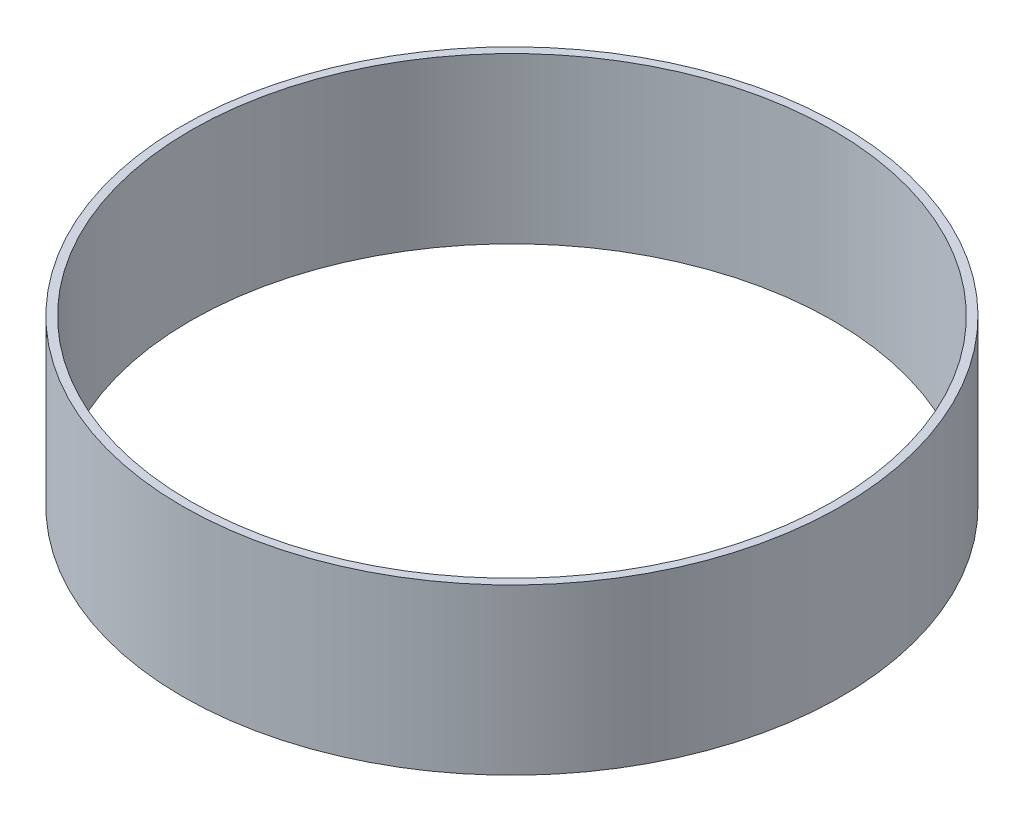
ISO-10303-21;
HEADER;
FILE_DESCRIPTION(('STEP AP214'),'2;1');
FILE_NAME('part.step','',(''),(''),'','','');
FILE_SCHEMA(('AUTOMOTIVE_DESIGN { 1 0 10303 214 1 1 1 1 }'));
ENDSEC;
DATA;
#1=APPLICATION_CONTEXT('core data for automotive mechanical design processes');
#2=APPLICATION_PROTOCOL_DEFINITION('international standard','automotive_design',2000,#1);
#3=PRODUCT_CONTEXT('',#1,'mechanical');
#4=PRODUCT('Part','Part','',(#3));
#5=PRODUCT_RELATED_PRODUCT_CATEGORY('part','',(#4));
#6=PRODUCT_DEFINITION_FORMATION('','',#4);
#7=PRODUCT_DEFINITION_CONTEXT('part definition',#1,'design');
#8=PRODUCT_DEFINITION('design','',#6,#7);
#9=PRODUCT_DEFINITION_SHAPE('','',#8);
#10=(LENGTH_UNIT() NAMED_UNIT(*) SI_UNIT(.MILLI.,.METRE.));
#11=(NAMED_UNIT(*) PLANE_ANGLE_UNIT() SI_UNIT($,.RADIAN.));
#12=(NAMED_UNIT(*) SI_UNIT($,.STERADIAN.) SOLID_ANGLE_UNIT());
#13=UNCERTAINTY_MEASURE_WITH_UNIT(LENGTH_MEASURE(1.E-05),#10,'distance_accuracy_value','');
#14=(GEOMETRIC_REPRESENTATION_CONTEXT(3) GLOBAL_UNCERTAINTY_ASSIGNED_CONTEXT((#13)) GLOBAL_UNIT_ASSIGNED_CONTEXT((#10,
#11,#12)) REPRESENTATION_CONTEXT('',''));
#15=CARTESIAN_POINT('',(0.,0.,0.));
#16=DIRECTION('',(0.,0.,1.));
#17=DIRECTION('',(1.,0.,0.));
#18=AXIS2_PLACEMENT_3D('',#15,#16,#17);
#19=CARTESIAN_POINT('',(0.,15.,0.));
#20=DIRECTION('',(0.,1.,0.));
#21=DIRECTION('',(0.,0.,1.));
#22=AXIS2_PLACEMENT_3D('',#19,#20,#21);
#23=PLANE('',#22);
#24=CARTESIAN_POINT('',(0.,15.,0.));
#25=DIRECTION('',(0.,1.,0.));
#26=DIRECTION('',(0.,0.,1.));
#27=AXIS2_PLACEMENT_3D('',#24,#25,#26);
#28=CIRCLE('',#27,60.);
#29=CARTESIAN_POINT('',(0.,15.,60.));
#30=VERTEX_POINT('',#29);
#31=EDGE_CURVE('E11',#30,#30,#28,.T.);
#32=ORIENTED_EDGE('',*,*,#31,.T.);
#33=EDGE_LOOP('',(#32));
#34=FACE_BOUND('',#33,.T.);
#35=CARTESIAN_POINT('',(0.,15.,0.));
#36=DIRECTION('',(0.,1.,0.));
#37=DIRECTION('',(1.,0.,0.));
#38=AXIS2_PLACEMENT_3D('',#35,#36,#37);
#39=CIRCLE('',#38,58.5);
#40=CARTESIAN_POINT('',(58.5,15.,0.));
#41=VERTEX_POINT('',#40);
#42=EDGE_CURVE('E48',#41,#41,#39,.T.);
#43=ORIENTED_EDGE('',*,*,#42,.F.);
#44=EDGE_LOOP('',(#43));
#45=FACE_BOUND('',#44,.T.);
#46=ADVANCED_FACE('F37',(#34,#45),#23,.T.);
#47=CARTESIAN_POINT('',(0.,-15.,0.));
#48=DIRECTION('',(0.,1.,0.));
#49=DIRECTION('',(0.,0.,1.));
#50=AXIS2_PLACEMENT_3D('',#47,#48,#49);
#51=PLANE('',#50);
#52=CARTESIAN_POINT('',(0.,-15.,0.));
#53=DIRECTION('',(0.,1.,0.));
#54=DIRECTION('',(0.,0.,1.));
#55=AXIS2_PLACEMENT_3D('',#52,#53,#54);
#56=CIRCLE('',#55,60.);
#57=CARTESIAN_POINT('',(0.,-15.,60.));
#58=VERTEX_POINT('',#57);
#59=EDGE_CURVE('E41',#58,#58,#56,.T.);
#60=ORIENTED_EDGE('',*,*,#59,.F.);
#61=EDGE_LOOP('',(#60));
#62=FACE_BOUND('',#61,.T.);
#63=CARTESIAN_POINT('',(0.,-15.,0.));
#64=DIRECTION('',(0.,1.,0.));
#65=DIRECTION('',(1.,0.,0.));
#66=AXIS2_PLACEMENT_3D('',#63,#64,#65);
#67=CIRCLE('',#66,58.5);
#68=CARTESIAN_POINT('',(58.5,-15.,0.));
#69=VERTEX_POINT('',#68);
#70=EDGE_CURVE('E50',#69,#69,#67,.T.);
#71=ORIENTED_EDGE('',*,*,#70,.T.);
#72=EDGE_LOOP('',(#71));
#73=FACE_BOUND('',#72,.T.);
#74=ADVANCED_FACE('F60',(#62,#73),#51,.F.);
#75=CARTESIAN_POINT('',(0.,15.,0.));
#76=DIRECTION('',(0.,-1.,0.));
#77=DIRECTION('',(0.,0.,-1.));
#78=AXIS2_PLACEMENT_3D('',#75,#76,#77);
#79=CYLINDRICAL_SURFACE('',#78,60.);
#80=ORIENTED_EDGE('',*,*,#31,.F.);
#81=EDGE_LOOP('',(#80));
#82=FACE_BOUND('',#81,.T.);
#83=ORIENTED_EDGE('',*,*,#59,.T.);
#84=EDGE_LOOP('',(#83));
#85=FACE_BOUND('',#84,.T.);
#86=ADVANCED_FACE('F39',(#82,#85),#79,.T.);
#87=CARTESIAN_POINT('',(0.,15.,0.));
#88=DIRECTION('',(0.,-1.,0.));
#89=DIRECTION('',(0.,0.,-1.));
#90=AXIS2_PLACEMENT_3D('',#87,#88,#89);
#91=CYLINDRICAL_SURFACE('',#90,58.5);
#92=ORIENTED_EDGE('',*,*,#42,.T.);
#93=EDGE_LOOP('',(#92));
#94=FACE_BOUND('',#93,.T.);
#95=ORIENTED_EDGE('',*,*,#70,.F.);
#96=EDGE_LOOP('',(#95));
#97=FACE_BOUND('',#96,.T.);
#98=ADVANCED_FACE('F56',(#94,#97),#91,.F.);
#99=CLOSED_SHELL('',(#46,#74,#86,#98));
#100=MANIFOLD_SOLID_BREP('B2',#99);
#101=ADVANCED_BREP_SHAPE_REPRESENTATION('',(#18,#100),#14);
#102=SHAPE_DEFINITION_REPRESENTATION(#9,#101);
ENDSEC;
END-ISO-10303-21;
